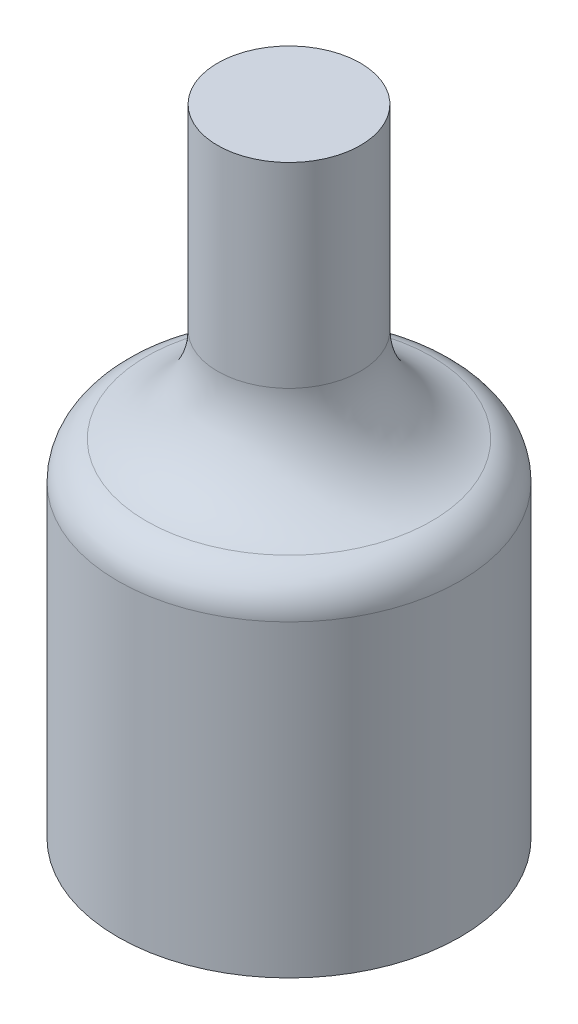
ISO-10303-21;
HEADER;
FILE_DESCRIPTION(('STEP AP214'),'2;1');
FILE_NAME('part.step','',(''),(''),'','','');
FILE_SCHEMA(('AUTOMOTIVE_DESIGN { 1 0 10303 214 1 1 1 1 }'));
ENDSEC;
DATA;
#1=APPLICATION_CONTEXT('core data for automotive mechanical design processes');
#2=APPLICATION_PROTOCOL_DEFINITION('international standard','automotive_design',2000,#1);
#3=PRODUCT_CONTEXT('',#1,'mechanical');
#4=PRODUCT('Part','Part','',(#3));
#5=PRODUCT_RELATED_PRODUCT_CATEGORY('part','',(#4));
#6=PRODUCT_DEFINITION_FORMATION('','',#4);
#7=PRODUCT_DEFINITION_CONTEXT('part definition',#1,'design');
#8=PRODUCT_DEFINITION('design','',#6,#7);
#9=PRODUCT_DEFINITION_SHAPE('','',#8);
#10=(LENGTH_UNIT() NAMED_UNIT(*) SI_UNIT(.MILLI.,.METRE.));
#11=(NAMED_UNIT(*) PLANE_ANGLE_UNIT() SI_UNIT($,.RADIAN.));
#12=(NAMED_UNIT(*) SI_UNIT($,.STERADIAN.) SOLID_ANGLE_UNIT());
#13=UNCERTAINTY_MEASURE_WITH_UNIT(LENGTH_MEASURE(1.E-05),#10,'distance_accuracy_value','');
#14=(GEOMETRIC_REPRESENTATION_CONTEXT(3) GLOBAL_UNCERTAINTY_ASSIGNED_CONTEXT((#13)) GLOBAL_UNIT_ASSIGNED_CONTEXT((#10,
#11,#12)) REPRESENTATION_CONTEXT('',''));
#15=CARTESIAN_POINT('',(0.,0.,0.));
#16=DIRECTION('',(0.,0.,1.));
#17=DIRECTION('',(1.,0.,0.));
#18=AXIS2_PLACEMENT_3D('',#15,#16,#17);
#19=CARTESIAN_POINT('',(0.,41.275,0.));
#20=DIRECTION('',(0.,1.,0.));
#21=DIRECTION('',(0.,0.,1.));
#22=AXIS2_PLACEMENT_3D('',#19,#20,#21);
#23=PLANE('',#22);
#24=CARTESIAN_POINT('',(0.,41.275,0.));
#25=DIRECTION('',(0.,-1.,0.));
#26=DIRECTION('',(0.,0.,-1.));
#27=AXIS2_PLACEMENT_3D('',#24,#25,#26);
#28=CIRCLE('',#27,4.6355);
#29=CARTESIAN_POINT('',(0.,41.275,-4.6355));
#30=VERTEX_POINT('',#29);
#31=EDGE_CURVE('E149',#30,#30,#28,.T.);
#32=ORIENTED_EDGE('',*,*,#31,.F.);
#33=EDGE_LOOP('',(#32));
#34=FACE_BOUND('',#33,.T.);
#35=ADVANCED_FACE('F39',(#34),#23,.T.);
#36=CARTESIAN_POINT('',(0.,0.,0.));
#37=DIRECTION('',(0.,-1.,0.));
#38=DIRECTION('',(0.,0.,-1.));
#39=AXIS2_PLACEMENT_3D('',#36,#37,#38);
#40=CYLINDRICAL_SURFACE('',#39,4.6355);
#41=CARTESIAN_POINT('',(0.,28.575,0.));
#42=DIRECTION('',(0.,1.,0.));
#43=DIRECTION('',(0.,0.,1.));
#44=AXIS2_PLACEMENT_3D('',#41,#42,#43);
#45=CIRCLE('',#44,4.6355);
#46=CARTESIAN_POINT('',(0.,28.575,4.6355));
#47=VERTEX_POINT('',#46);
#48=EDGE_CURVE('E152',#47,#47,#45,.T.);
#49=ORIENTED_EDGE('',*,*,#48,.T.);
#50=EDGE_LOOP('',(#49));
#51=FACE_BOUND('',#50,.T.);
#52=ORIENTED_EDGE('',*,*,#31,.T.);
#53=EDGE_LOOP('',(#52));
#54=FACE_BOUND('',#53,.T.);
#55=ADVANCED_FACE('F169',(#51,#54),#40,.T.);
#56=CARTESIAN_POINT('',(0.,0.,0.));
#57=DIRECTION('',(0.,-1.,0.));
#58=DIRECTION('',(0.,0.,-1.));
#59=AXIS2_PLACEMENT_3D('',#56,#57,#58);
#60=CYLINDRICAL_SURFACE('',#59,11.1125);
#61=CARTESIAN_POINT('',(0.,20.0187431665477,0.));
#62=DIRECTION('',(0.,1.,0.));
#63=DIRECTION('',(0.,0.,1.));
#64=AXIS2_PLACEMENT_3D('',#61,#62,#63);
#65=CIRCLE('',#64,11.1125);
#66=CARTESIAN_POINT('',(0.,20.0187431665477,11.1125));
#67=VERTEX_POINT('',#66);
#68=EDGE_CURVE('E47',#67,#67,#65,.F.);
#69=ORIENTED_EDGE('',*,*,#68,.T.);
#70=EDGE_LOOP('',(#69));
#71=FACE_BOUND('',#70,.T.);
#72=CARTESIAN_POINT('',(0.,0.,0.));
#73=DIRECTION('',(0.,-1.,0.));
#74=DIRECTION('',(0.,0.,-1.));
#75=AXIS2_PLACEMENT_3D('',#72,#73,#74);
#76=CIRCLE('',#75,11.1125);
#77=CARTESIAN_POINT('',(0.,0.,-11.1125));
#78=VERTEX_POINT('',#77);
#79=EDGE_CURVE('E141',#78,#78,#76,.T.);
#80=ORIENTED_EDGE('',*,*,#79,.F.);
#81=EDGE_LOOP('',(#80));
#82=FACE_BOUND('',#81,.T.);
#83=ADVANCED_FACE('F157',(#71,#82),#60,.T.);
#84=CARTESIAN_POINT('',(11.1125,0.,0.));
#85=DIRECTION('',(0.,-1.,0.));
#86=DIRECTION('',(0.,0.,-1.));
#87=AXIS2_PLACEMENT_3D('',#84,#85,#86);
#88=PLANE('',#87);
#89=DIRECTION('',(0.,0.,1.));
#90=VECTOR('',#89,1.);
#91=CARTESIAN_POINT('',(6.604,0.,-3.81282117772829));
#92=LINE('',#91,#90);
#93=CARTESIAN_POINT('',(6.604,0.,-3.81282117772829));
#94=VERTEX_POINT('',#93);
#95=CARTESIAN_POINT('',(6.604,0.,3.81282117772829));
#96=VERTEX_POINT('',#95);
#97=EDGE_CURVE('E54',#94,#96,#92,.T.);
#98=ORIENTED_EDGE('',*,*,#97,.F.);
#99=DIRECTION('',(0.866025403784439,0.,0.5));
#100=VECTOR('',#99,1.);
#101=CARTESIAN_POINT('',(0.,0.,-7.62564235545658));
#102=LINE('',#101,#100);
#103=CARTESIAN_POINT('',(0.,0.,-7.62564235545658));
#104=VERTEX_POINT('',#103);
#105=EDGE_CURVE('E137',#104,#94,#102,.T.);
#106=ORIENTED_EDGE('',*,*,#105,.F.);
#107=DIRECTION('',(0.866025403784439,0.,-0.5));
#108=VECTOR('',#107,1.);
#109=CARTESIAN_POINT('',(-6.60399999999999,0.,-3.81282117772829));
#110=LINE('',#109,#108);
#111=CARTESIAN_POINT('',(-6.60399999999999,0.,-3.81282117772829));
#112=VERTEX_POINT('',#111);
#113=EDGE_CURVE('E135',#112,#104,#110,.T.);
#114=ORIENTED_EDGE('',*,*,#113,.F.);
#115=DIRECTION('',(0.,0.,-1.));
#116=VECTOR('',#115,1.);
#117=CARTESIAN_POINT('',(-6.604,0.,3.81282117772829));
#118=LINE('',#117,#116);
#119=CARTESIAN_POINT('',(-6.604,0.,3.81282117772829));
#120=VERTEX_POINT('',#119);
#121=EDGE_CURVE('E102',#120,#112,#118,.T.);
#122=ORIENTED_EDGE('',*,*,#121,.F.);
#123=DIRECTION('',(-0.866025403784439,0.,-0.5));
#124=VECTOR('',#123,1.);
#125=CARTESIAN_POINT('',(0.,0.,7.62564235545658));
#126=LINE('',#125,#124);
#127=CARTESIAN_POINT('',(0.,0.,7.62564235545658));
#128=VERTEX_POINT('',#127);
#129=EDGE_CURVE('E131',#128,#120,#126,.T.);
#130=ORIENTED_EDGE('',*,*,#129,.F.);
#131=DIRECTION('',(-0.866025403784439,0.,0.5));
#132=VECTOR('',#131,1.);
#133=CARTESIAN_POINT('',(6.604,0.,3.81282117772829));
#134=LINE('',#133,#132);
#135=EDGE_CURVE('E128',#96,#128,#134,.T.);
#136=ORIENTED_EDGE('',*,*,#135,.F.);
#137=EDGE_LOOP('',(#98,#106,#114,#122,#130,#136));
#138=FACE_BOUND('',#137,.T.);
#139=ORIENTED_EDGE('',*,*,#79,.T.);
#140=EDGE_LOOP('',(#139));
#141=FACE_BOUND('',#140,.T.);
#142=ADVANCED_FACE('F181',(#138,#141),#88,.T.);
#143=CARTESIAN_POINT('',(6.604,15.875,-3.81282117772829));
#144=DIRECTION('',(1.,0.,0.));
#145=DIRECTION('',(0.,0.,-1.));
#146=AXIS2_PLACEMENT_3D('',#143,#144,#145);
#147=PLANE('',#146);
#148=ORIENTED_EDGE('',*,*,#97,.T.);
#149=DIRECTION('',(0.,-1.,0.));
#150=VECTOR('',#149,1.);
#151=CARTESIAN_POINT('',(6.604,15.875,3.81282117772829));
#152=LINE('',#151,#150);
#153=CARTESIAN_POINT('',(6.604,15.875,3.81282117772829));
#154=VERTEX_POINT('',#153);
#155=EDGE_CURVE('E84',#154,#96,#152,.T.);
#156=ORIENTED_EDGE('',*,*,#155,.F.);
#157=DIRECTION('',(0.,0.,1.));
#158=VECTOR('',#157,1.);
#159=CARTESIAN_POINT('',(6.604,15.875,-3.81282117772829));
#160=LINE('',#159,#158);
#161=CARTESIAN_POINT('',(6.604,15.875,-3.81282117772829));
#162=VERTEX_POINT('',#161);
#163=EDGE_CURVE('E139',#162,#154,#160,.T.);
#164=ORIENTED_EDGE('',*,*,#163,.F.);
#165=DIRECTION('',(0.,-1.,0.));
#166=VECTOR('',#165,1.);
#167=CARTESIAN_POINT('',(6.604,15.875,-3.81282117772829));
#168=LINE('',#167,#166);
#169=EDGE_CURVE('E62',#162,#94,#168,.T.);
#170=ORIENTED_EDGE('',*,*,#169,.T.);
#171=EDGE_LOOP('',(#148,#156,#164,#170));
#172=FACE_BOUND('',#171,.T.);
#173=ADVANCED_FACE('F184',(#172),#147,.F.);
#174=CARTESIAN_POINT('',(0.,15.875,-7.62564235545658));
#175=DIRECTION('',(0.5,0.,-0.866025403784439));
#176=DIRECTION('',(-0.866025403784439,0.,-0.5));
#177=AXIS2_PLACEMENT_3D('',#174,#175,#176);
#178=PLANE('',#177);
#179=ORIENTED_EDGE('',*,*,#105,.T.);
#180=ORIENTED_EDGE('',*,*,#169,.F.);
#181=DIRECTION('',(0.866025403784439,0.,0.5));
#182=VECTOR('',#181,1.);
#183=CARTESIAN_POINT('',(0.,15.875,-7.62564235545658));
#184=LINE('',#183,#182);
#185=CARTESIAN_POINT('',(0.,15.875,-7.62564235545658));
#186=VERTEX_POINT('',#185);
#187=EDGE_CURVE('E114',#186,#162,#184,.T.);
#188=ORIENTED_EDGE('',*,*,#187,.F.);
#189=DIRECTION('',(0.,-1.,0.));
#190=VECTOR('',#189,1.);
#191=CARTESIAN_POINT('',(0.,15.875,-7.62564235545658));
#192=LINE('',#191,#190);
#193=EDGE_CURVE('E106',#186,#104,#192,.T.);
#194=ORIENTED_EDGE('',*,*,#193,.T.);
#195=EDGE_LOOP('',(#179,#180,#188,#194));
#196=FACE_BOUND('',#195,.T.);
#197=ADVANCED_FACE('F188',(#196),#178,.F.);
#198=CARTESIAN_POINT('',(-6.60399999999999,15.875,-3.81282117772829));
#199=DIRECTION('',(-0.5,0.,-0.866025403784439));
#200=DIRECTION('',(-0.866025403784439,0.,0.5));
#201=AXIS2_PLACEMENT_3D('',#198,#199,#200);
#202=PLANE('',#201);
#203=ORIENTED_EDGE('',*,*,#113,.T.);
#204=ORIENTED_EDGE('',*,*,#193,.F.);
#205=DIRECTION('',(0.866025403784439,0.,-0.5));
#206=VECTOR('',#205,1.);
#207=CARTESIAN_POINT('',(-6.60399999999999,15.875,-3.81282117772829));
#208=LINE('',#207,#206);
#209=CARTESIAN_POINT('',(-6.60399999999999,15.875,-3.81282117772829));
#210=VERTEX_POINT('',#209);
#211=EDGE_CURVE('E110',#210,#186,#208,.T.);
#212=ORIENTED_EDGE('',*,*,#211,.F.);
#213=DIRECTION('',(0.,-1.,0.));
#214=VECTOR('',#213,1.);
#215=CARTESIAN_POINT('',(-6.60399999999999,15.875,-3.81282117772829));
#216=LINE('',#215,#214);
#217=EDGE_CURVE('E95',#210,#112,#216,.T.);
#218=ORIENTED_EDGE('',*,*,#217,.T.);
#219=EDGE_LOOP('',(#203,#204,#212,#218));
#220=FACE_BOUND('',#219,.T.);
#221=ADVANCED_FACE('F111',(#220),#202,.F.);
#222=CARTESIAN_POINT('',(-6.604,15.875,3.81282117772829));
#223=DIRECTION('',(-1.,0.,0.));
#224=DIRECTION('',(0.,0.,1.));
#225=AXIS2_PLACEMENT_3D('',#222,#223,#224);
#226=PLANE('',#225);
#227=ORIENTED_EDGE('',*,*,#121,.T.);
#228=ORIENTED_EDGE('',*,*,#217,.F.);
#229=DIRECTION('',(0.,0.,-1.));
#230=VECTOR('',#229,1.);
#231=CARTESIAN_POINT('',(-6.604,15.875,3.81282117772829));
#232=LINE('',#231,#230);
#233=CARTESIAN_POINT('',(-6.604,15.875,3.81282117772829));
#234=VERTEX_POINT('',#233);
#235=EDGE_CURVE('E99',#234,#210,#232,.T.);
#236=ORIENTED_EDGE('',*,*,#235,.F.);
#237=DIRECTION('',(0.,-1.,0.));
#238=VECTOR('',#237,1.);
#239=CARTESIAN_POINT('',(-6.604,15.875,3.81282117772829));
#240=LINE('',#239,#238);
#241=EDGE_CURVE('E107',#234,#120,#240,.T.);
#242=ORIENTED_EDGE('',*,*,#241,.T.);
#243=EDGE_LOOP('',(#227,#228,#236,#242));
#244=FACE_BOUND('',#243,.T.);
#245=ADVANCED_FACE('F97',(#244),#226,.F.);
#246=CARTESIAN_POINT('',(0.,15.875,7.62564235545658));
#247=DIRECTION('',(-0.5,0.,0.866025403784439));
#248=DIRECTION('',(0.866025403784439,0.,0.5));
#249=AXIS2_PLACEMENT_3D('',#246,#247,#248);
#250=PLANE('',#249);
#251=ORIENTED_EDGE('',*,*,#129,.T.);
#252=ORIENTED_EDGE('',*,*,#241,.F.);
#253=DIRECTION('',(-0.866025403784439,0.,-0.5));
#254=VECTOR('',#253,1.);
#255=CARTESIAN_POINT('',(0.,15.875,7.62564235545658));
#256=LINE('',#255,#254);
#257=CARTESIAN_POINT('',(0.,15.875,7.62564235545658));
#258=VERTEX_POINT('',#257);
#259=EDGE_CURVE('E120',#258,#234,#256,.T.);
#260=ORIENTED_EDGE('',*,*,#259,.F.);
#261=DIRECTION('',(0.,-1.,0.));
#262=VECTOR('',#261,1.);
#263=CARTESIAN_POINT('',(0.,15.875,7.62564235545658));
#264=LINE('',#263,#262);
#265=EDGE_CURVE('E144',#258,#128,#264,.T.);
#266=ORIENTED_EDGE('',*,*,#265,.T.);
#267=EDGE_LOOP('',(#251,#252,#260,#266));
#268=FACE_BOUND('',#267,.T.);
#269=ADVANCED_FACE('F192',(#268),#250,.F.);
#270=CARTESIAN_POINT('',(6.604,15.875,3.81282117772829));
#271=DIRECTION('',(0.5,0.,0.866025403784439));
#272=DIRECTION('',(0.866025403784439,0.,-0.5));
#273=AXIS2_PLACEMENT_3D('',#270,#271,#272);
#274=PLANE('',#273);
#275=ORIENTED_EDGE('',*,*,#135,.T.);
#276=ORIENTED_EDGE('',*,*,#265,.F.);
#277=DIRECTION('',(-0.866025403784439,0.,0.5));
#278=VECTOR('',#277,1.);
#279=CARTESIAN_POINT('',(6.604,15.875,3.81282117772829));
#280=LINE('',#279,#278);
#281=EDGE_CURVE('E122',#154,#258,#280,.T.);
#282=ORIENTED_EDGE('',*,*,#281,.F.);
#283=ORIENTED_EDGE('',*,*,#155,.T.);
#284=EDGE_LOOP('',(#275,#276,#282,#283));
#285=FACE_BOUND('',#284,.T.);
#286=ADVANCED_FACE('F189',(#285),#274,.F.);
#287=CARTESIAN_POINT('',(0.,15.875,0.));
#288=DIRECTION('',(0.,-1.,0.));
#289=DIRECTION('',(0.,0.,-1.));
#290=AXIS2_PLACEMENT_3D('',#287,#288,#289);
#291=PLANE('',#290);
#292=ORIENTED_EDGE('',*,*,#163,.T.);
#293=ORIENTED_EDGE('',*,*,#281,.T.);
#294=ORIENTED_EDGE('',*,*,#259,.T.);
#295=ORIENTED_EDGE('',*,*,#235,.T.);
#296=ORIENTED_EDGE('',*,*,#211,.T.);
#297=ORIENTED_EDGE('',*,*,#187,.T.);
#298=EDGE_LOOP('',(#292,#293,#294,#295,#296,#297));
#299=FACE_BOUND('',#298,.T.);
#300=ADVANCED_FACE('F117',(#299),#291,.T.);
#301=CARTESIAN_POINT('',(0.,28.575,0.));
#302=DIRECTION('',(0.,1.,0.));
#303=DIRECTION('',(0.,0.,1.));
#304=AXIS2_PLACEMENT_3D('',#301,#302,#303);
#305=TOROIDAL_SURFACE('',#304,10.9855,6.35);
#306=CARTESIAN_POINT('',(0.,22.4633879761055,0.));
#307=DIRECTION('',(0.,1.,0.));
#308=DIRECTION('',(0.,0.,1.));
#309=AXIS2_PLACEMENT_3D('',#306,#307,#308);
#310=CIRCLE('',#309,9.26192857142857);
#311=CARTESIAN_POINT('',(0.,22.4633879761055,9.26192857142857));
#312=VERTEX_POINT('',#311);
#313=EDGE_CURVE('E11',#312,#312,#310,.T.);
#314=ORIENTED_EDGE('',*,*,#313,.T.);
#315=EDGE_LOOP('',(#314));
#316=FACE_BOUND('',#315,.T.);
#317=ORIENTED_EDGE('',*,*,#48,.F.);
#318=EDGE_LOOP('',(#317));
#319=FACE_BOUND('',#318,.T.);
#320=ADVANCED_FACE('F161',(#316,#319),#305,.F.);
#321=CARTESIAN_POINT('',(0.,20.0187431665477,0.));
#322=DIRECTION('',(0.,1.,0.));
#323=DIRECTION('',(0.,0.,1.));
#324=AXIS2_PLACEMENT_3D('',#321,#322,#323);
#325=TOROIDAL_SURFACE('',#324,8.5725,2.54);
#326=ORIENTED_EDGE('',*,*,#313,.F.);
#327=EDGE_LOOP('',(#326));
#328=FACE_BOUND('',#327,.T.);
#329=ORIENTED_EDGE('',*,*,#68,.F.);
#330=EDGE_LOOP('',(#329));
#331=FACE_BOUND('',#330,.T.);
#332=ADVANCED_FACE('F41',(#328,#331),#325,.T.);
#333=CLOSED_SHELL('',(#35,#55,#83,#142,#173,#197,#221,#245,#269,#286,#300,#320,#332));
#334=MANIFOLD_SOLID_BREP('B2',#333);
#335=ADVANCED_BREP_SHAPE_REPRESENTATION('',(#18,#334),#14);
#336=SHAPE_DEFINITION_REPRESENTATION(#9,#335);
ENDSEC;
END-ISO-10303-21;
